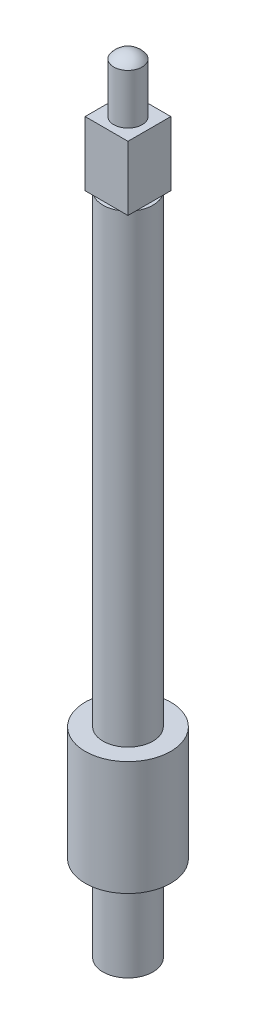
ISO-10303-21;
HEADER;
FILE_DESCRIPTION(('STEP AP214'),'2;1');
FILE_NAME('part.step','',(''),(''),'','','');
FILE_SCHEMA(('AUTOMOTIVE_DESIGN { 1 0 10303 214 1 1 1 1 }'));
ENDSEC;
DATA;
#1=APPLICATION_CONTEXT('core data for automotive mechanical design processes');
#2=APPLICATION_PROTOCOL_DEFINITION('international standard','automotive_design',2000,#1);
#3=PRODUCT_CONTEXT('',#1,'mechanical');
#4=PRODUCT('Part','Part','',(#3));
#5=PRODUCT_RELATED_PRODUCT_CATEGORY('part','',(#4));
#6=PRODUCT_DEFINITION_FORMATION('','',#4);
#7=PRODUCT_DEFINITION_CONTEXT('part definition',#1,'design');
#8=PRODUCT_DEFINITION('design','',#6,#7);
#9=PRODUCT_DEFINITION_SHAPE('','',#8);
#10=(LENGTH_UNIT() NAMED_UNIT(*) SI_UNIT(.MILLI.,.METRE.));
#11=(NAMED_UNIT(*) PLANE_ANGLE_UNIT() SI_UNIT($,.RADIAN.));
#12=(NAMED_UNIT(*) SI_UNIT($,.STERADIAN.) SOLID_ANGLE_UNIT());
#13=UNCERTAINTY_MEASURE_WITH_UNIT(LENGTH_MEASURE(1.E-05),#10,'distance_accuracy_value','');
#14=(GEOMETRIC_REPRESENTATION_CONTEXT(3) GLOBAL_UNCERTAINTY_ASSIGNED_CONTEXT((#13)) GLOBAL_UNIT_ASSIGNED_CONTEXT((#10,
#11,#12)) REPRESENTATION_CONTEXT('',''));
#15=CARTESIAN_POINT('',(0.,0.,0.));
#16=DIRECTION('',(0.,0.,1.));
#17=DIRECTION('',(1.,0.,0.));
#18=AXIS2_PLACEMENT_3D('',#15,#16,#17);
#19=CARTESIAN_POINT('',(0.,81.,0.));
#20=DIRECTION('',(0.,1.,0.));
#21=DIRECTION('',(0.,0.,1.));
#22=AXIS2_PLACEMENT_3D('',#19,#20,#21);
#23=PLANE('',#22);
#24=DIRECTION('',(0.,0.,-1.));
#25=VECTOR('',#24,1.);
#26=CARTESIAN_POINT('',(3.,81.,-3.));
#27=LINE('',#26,#25);
#28=CARTESIAN_POINT('',(3.,81.,1.802775637732));
#29=VERTEX_POINT('',#28);
#30=CARTESIAN_POINT('',(3.,81.,-1.802775637732));
#31=VERTEX_POINT('',#30);
#32=EDGE_CURVE('E51',#29,#31,#27,.T.);
#33=ORIENTED_EDGE('',*,*,#32,.F.);
#34=CARTESIAN_POINT('',(0.,81.,0.));
#35=DIRECTION('',(0.,1.,0.));
#36=DIRECTION('',(0.,0.,1.));
#37=AXIS2_PLACEMENT_3D('',#34,#35,#36);
#38=CIRCLE('',#37,3.5);
#39=EDGE_CURVE('E175',#29,#31,#38,.T.);
#40=ORIENTED_EDGE('',*,*,#39,.T.);
#41=EDGE_LOOP('',(#33,#40));
#42=FACE_BOUND('',#41,.T.);
#43=ADVANCED_FACE('F42',(#42),#23,.T.);
#44=DIRECTION('',(1.,0.,0.));
#45=VECTOR('',#44,1.);
#46=CARTESIAN_POINT('',(-3.,81.,3.));
#47=LINE('',#46,#45);
#48=CARTESIAN_POINT('',(-1.802775637732,81.,3.));
#49=VERTEX_POINT('',#48);
#50=CARTESIAN_POINT('',(1.802775637732,81.,3.));
#51=VERTEX_POINT('',#50);
#52=EDGE_CURVE('E57',#49,#51,#47,.T.);
#53=ORIENTED_EDGE('',*,*,#52,.F.);
#54=EDGE_CURVE('E176',#49,#51,#38,.T.);
#55=ORIENTED_EDGE('',*,*,#54,.T.);
#56=EDGE_LOOP('',(#53,#55));
#57=FACE_BOUND('',#56,.T.);
#58=ADVANCED_FACE('F203',(#57),#23,.T.);
#59=DIRECTION('',(0.,0.,1.));
#60=VECTOR('',#59,1.);
#61=CARTESIAN_POINT('',(-3.,81.,-3.));
#62=LINE('',#61,#60);
#63=CARTESIAN_POINT('',(-3.,81.,-1.80277563773199));
#64=VERTEX_POINT('',#63);
#65=CARTESIAN_POINT('',(-3.,81.,1.80277563773199));
#66=VERTEX_POINT('',#65);
#67=EDGE_CURVE('E156',#64,#66,#62,.T.);
#68=ORIENTED_EDGE('',*,*,#67,.F.);
#69=EDGE_CURVE('E228',#64,#66,#38,.T.);
#70=ORIENTED_EDGE('',*,*,#69,.T.);
#71=EDGE_LOOP('',(#68,#70));
#72=FACE_BOUND('',#71,.T.);
#73=ADVANCED_FACE('F209',(#72),#23,.T.);
#74=CARTESIAN_POINT('',(0.,16.,0.));
#75=DIRECTION('',(0.,-1.,0.));
#76=DIRECTION('',(0.,0.,-1.));
#77=AXIS2_PLACEMENT_3D('',#74,#75,#76);
#78=CYLINDRICAL_SURFACE('',#77,5.985);
#79=CARTESIAN_POINT('',(0.,16.,0.));
#80=DIRECTION('',(0.,1.,0.));
#81=DIRECTION('',(0.,0.,1.));
#82=AXIS2_PLACEMENT_3D('',#79,#80,#81);
#83=CIRCLE('',#82,5.985);
#84=CARTESIAN_POINT('',(0.,16.,5.985));
#85=VERTEX_POINT('',#84);
#86=EDGE_CURVE('E179',#85,#85,#83,.T.);
#87=ORIENTED_EDGE('',*,*,#86,.F.);
#88=EDGE_LOOP('',(#87));
#89=FACE_BOUND('',#88,.T.);
#90=CARTESIAN_POINT('',(0.,0.,0.));
#91=DIRECTION('',(0.,1.,0.));
#92=DIRECTION('',(0.,0.,1.));
#93=AXIS2_PLACEMENT_3D('',#90,#91,#92);
#94=CIRCLE('',#93,5.985);
#95=CARTESIAN_POINT('',(0.,0.,5.985));
#96=VERTEX_POINT('',#95);
#97=EDGE_CURVE('E174',#96,#96,#94,.T.);
#98=ORIENTED_EDGE('',*,*,#97,.T.);
#99=EDGE_LOOP('',(#98));
#100=FACE_BOUND('',#99,.T.);
#101=ADVANCED_FACE('F185',(#89,#100),#78,.T.);
#102=CARTESIAN_POINT('',(0.,16.,0.));
#103=DIRECTION('',(0.,1.,0.));
#104=DIRECTION('',(0.,0.,1.));
#105=AXIS2_PLACEMENT_3D('',#102,#103,#104);
#106=PLANE('',#105);
#107=CARTESIAN_POINT('',(0.,16.,0.));
#108=DIRECTION('',(0.,1.,0.));
#109=DIRECTION('',(0.,0.,1.));
#110=AXIS2_PLACEMENT_3D('',#107,#108,#109);
#111=CIRCLE('',#110,3.5);
#112=CARTESIAN_POINT('',(0.,16.,3.5));
#113=VERTEX_POINT('',#112);
#114=EDGE_CURVE('E170',#113,#113,#111,.T.);
#115=ORIENTED_EDGE('',*,*,#114,.F.);
#116=EDGE_LOOP('',(#115));
#117=FACE_BOUND('',#116,.T.);
#118=ORIENTED_EDGE('',*,*,#86,.T.);
#119=EDGE_LOOP('',(#118));
#120=FACE_BOUND('',#119,.T.);
#121=ADVANCED_FACE('F190',(#117,#120),#106,.T.);
#122=CARTESIAN_POINT('',(0.,0.,0.));
#123=DIRECTION('',(0.,1.,0.));
#124=DIRECTION('',(0.,0.,1.));
#125=AXIS2_PLACEMENT_3D('',#122,#123,#124);
#126=PLANE('',#125);
#127=CARTESIAN_POINT('',(0.,0.,0.));
#128=DIRECTION('',(0.,1.,0.));
#129=DIRECTION('',(0.,0.,1.));
#130=AXIS2_PLACEMENT_3D('',#127,#128,#129);
#131=CIRCLE('',#130,3.5);
#132=CARTESIAN_POINT('',(0.,0.,3.5));
#133=VERTEX_POINT('',#132);
#134=EDGE_CURVE('E11',#133,#133,#131,.F.);
#135=ORIENTED_EDGE('',*,*,#134,.F.);
#136=EDGE_LOOP('',(#135));
#137=FACE_BOUND('',#136,.T.);
#138=ORIENTED_EDGE('',*,*,#97,.F.);
#139=EDGE_LOOP('',(#138));
#140=FACE_BOUND('',#139,.T.);
#141=ADVANCED_FACE('F187',(#137,#140),#126,.F.);
#142=CARTESIAN_POINT('',(0.,81.,0.));
#143=DIRECTION('',(0.,-1.,0.));
#144=DIRECTION('',(0.,0.,-1.));
#145=AXIS2_PLACEMENT_3D('',#142,#143,#144);
#146=CYLINDRICAL_SURFACE('',#145,3.5);
#147=EDGE_CURVE('E171',#51,#29,#38,.T.);
#148=ORIENTED_EDGE('',*,*,#147,.F.);
#149=ORIENTED_EDGE('',*,*,#54,.F.);
#150=EDGE_CURVE('E64',#66,#49,#38,.T.);
#151=ORIENTED_EDGE('',*,*,#150,.F.);
#152=ORIENTED_EDGE('',*,*,#69,.F.);
#153=CARTESIAN_POINT('',(-1.80277563773199,81.,-3.));
#154=VERTEX_POINT('',#153);
#155=EDGE_CURVE('E236',#154,#64,#38,.T.);
#156=ORIENTED_EDGE('',*,*,#155,.F.);
#157=CARTESIAN_POINT('',(1.80277563773199,81.,-3.));
#158=VERTEX_POINT('',#157);
#159=EDGE_CURVE('E242',#158,#154,#38,.T.);
#160=ORIENTED_EDGE('',*,*,#159,.F.);
#161=EDGE_CURVE('E252',#31,#158,#38,.T.);
#162=ORIENTED_EDGE('',*,*,#161,.F.);
#163=ORIENTED_EDGE('',*,*,#39,.F.);
#164=EDGE_LOOP('',(#148,#149,#151,#152,#156,#160,#162,#163));
#165=FACE_BOUND('',#164,.T.);
#166=ORIENTED_EDGE('',*,*,#114,.T.);
#167=EDGE_LOOP('',(#166));
#168=FACE_BOUND('',#167,.T.);
#169=ADVANCED_FACE('F189',(#165,#168),#146,.T.);
#170=DIRECTION('',(-1.,0.,0.));
#171=VECTOR('',#170,1.);
#172=CARTESIAN_POINT('',(-3.,81.,-3.));
#173=LINE('',#172,#171);
#174=EDGE_CURVE('E151',#158,#154,#173,.T.);
#175=ORIENTED_EDGE('',*,*,#174,.F.);
#176=ORIENTED_EDGE('',*,*,#159,.T.);
#177=EDGE_LOOP('',(#175,#176));
#178=FACE_BOUND('',#177,.T.);
#179=ADVANCED_FACE('F197',(#178),#23,.T.);
#180=CARTESIAN_POINT('',(0.,81.,0.));
#181=DIRECTION('',(0.,1.,0.));
#182=DIRECTION('',(0.,0.,1.));
#183=AXIS2_PLACEMENT_3D('',#180,#181,#182);
#184=PLANE('',#183);
#185=CARTESIAN_POINT('',(3.,81.,3.));
#186=VERTEX_POINT('',#185);
#187=EDGE_CURVE('E155',#51,#186,#47,.T.);
#188=ORIENTED_EDGE('',*,*,#187,.F.);
#189=ORIENTED_EDGE('',*,*,#147,.T.);
#190=EDGE_CURVE('E142',#186,#29,#27,.T.);
#191=ORIENTED_EDGE('',*,*,#190,.F.);
#192=EDGE_LOOP('',(#188,#189,#191));
#193=FACE_BOUND('',#192,.T.);
#194=ADVANCED_FACE('F212',(#193),#184,.F.);
#195=CARTESIAN_POINT('',(3.,81.,-3.));
#196=VERTEX_POINT('',#195);
#197=EDGE_CURVE('E146',#31,#196,#27,.T.);
#198=ORIENTED_EDGE('',*,*,#197,.F.);
#199=ORIENTED_EDGE('',*,*,#161,.T.);
#200=EDGE_CURVE('E147',#196,#158,#173,.T.);
#201=ORIENTED_EDGE('',*,*,#200,.F.);
#202=EDGE_LOOP('',(#198,#199,#201));
#203=FACE_BOUND('',#202,.T.);
#204=ADVANCED_FACE('F217',(#203),#184,.F.);
#205=CARTESIAN_POINT('',(-3.,81.,-3.));
#206=VERTEX_POINT('',#205);
#207=EDGE_CURVE('E145',#154,#206,#173,.T.);
#208=ORIENTED_EDGE('',*,*,#207,.F.);
#209=ORIENTED_EDGE('',*,*,#155,.T.);
#210=EDGE_CURVE('E152',#206,#64,#62,.T.);
#211=ORIENTED_EDGE('',*,*,#210,.F.);
#212=EDGE_LOOP('',(#208,#209,#211));
#213=FACE_BOUND('',#212,.T.);
#214=ADVANCED_FACE('F240',(#213),#184,.F.);
#215=CARTESIAN_POINT('',(-3.,81.,3.));
#216=VERTEX_POINT('',#215);
#217=EDGE_CURVE('E150',#66,#216,#62,.T.);
#218=ORIENTED_EDGE('',*,*,#217,.F.);
#219=ORIENTED_EDGE('',*,*,#150,.T.);
#220=EDGE_CURVE('E135',#216,#49,#47,.T.);
#221=ORIENTED_EDGE('',*,*,#220,.F.);
#222=EDGE_LOOP('',(#218,#219,#221));
#223=FACE_BOUND('',#222,.T.);
#224=ADVANCED_FACE('F220',(#223),#184,.F.);
#225=CARTESIAN_POINT('',(3.,90.,-3.));
#226=DIRECTION('',(-1.,0.,0.));
#227=DIRECTION('',(0.,0.,1.));
#228=AXIS2_PLACEMENT_3D('',#225,#226,#227);
#229=PLANE('',#228);
#230=ORIENTED_EDGE('',*,*,#190,.T.);
#231=ORIENTED_EDGE('',*,*,#32,.T.);
#232=ORIENTED_EDGE('',*,*,#197,.T.);
#233=DIRECTION('',(0.,-1.,0.));
#234=VECTOR('',#233,1.);
#235=CARTESIAN_POINT('',(3.,90.,-3.));
#236=LINE('',#235,#234);
#237=CARTESIAN_POINT('',(3.,90.,-3.));
#238=VERTEX_POINT('',#237);
#239=EDGE_CURVE('E167',#238,#196,#236,.T.);
#240=ORIENTED_EDGE('',*,*,#239,.F.);
#241=DIRECTION('',(0.,0.,-1.));
#242=VECTOR('',#241,1.);
#243=CARTESIAN_POINT('',(3.,90.,-3.));
#244=LINE('',#243,#242);
#245=CARTESIAN_POINT('',(3.,90.,3.));
#246=VERTEX_POINT('',#245);
#247=EDGE_CURVE('E131',#246,#238,#244,.T.);
#248=ORIENTED_EDGE('',*,*,#247,.F.);
#249=DIRECTION('',(0.,-1.,0.));
#250=VECTOR('',#249,1.);
#251=CARTESIAN_POINT('',(3.,90.,3.));
#252=LINE('',#251,#250);
#253=EDGE_CURVE('E141',#246,#186,#252,.T.);
#254=ORIENTED_EDGE('',*,*,#253,.T.);
#255=EDGE_LOOP('',(#230,#231,#232,#240,#248,#254));
#256=FACE_BOUND('',#255,.T.);
#257=ADVANCED_FACE('F260',(#256),#229,.F.);
#258=CARTESIAN_POINT('',(-3.,90.,-3.));
#259=DIRECTION('',(0.,0.,1.));
#260=DIRECTION('',(1.,0.,0.));
#261=AXIS2_PLACEMENT_3D('',#258,#259,#260);
#262=PLANE('',#261);
#263=ORIENTED_EDGE('',*,*,#200,.T.);
#264=ORIENTED_EDGE('',*,*,#174,.T.);
#265=ORIENTED_EDGE('',*,*,#207,.T.);
#266=DIRECTION('',(0.,-1.,0.));
#267=VECTOR('',#266,1.);
#268=CARTESIAN_POINT('',(-3.,90.,-3.));
#269=LINE('',#268,#267);
#270=CARTESIAN_POINT('',(-3.,90.,-3.));
#271=VERTEX_POINT('',#270);
#272=EDGE_CURVE('E164',#271,#206,#269,.T.);
#273=ORIENTED_EDGE('',*,*,#272,.F.);
#274=DIRECTION('',(-1.,0.,0.));
#275=VECTOR('',#274,1.);
#276=CARTESIAN_POINT('',(-3.,90.,-3.));
#277=LINE('',#276,#275);
#278=EDGE_CURVE('E134',#238,#271,#277,.T.);
#279=ORIENTED_EDGE('',*,*,#278,.F.);
#280=ORIENTED_EDGE('',*,*,#239,.T.);
#281=EDGE_LOOP('',(#263,#264,#265,#273,#279,#280));
#282=FACE_BOUND('',#281,.T.);
#283=ADVANCED_FACE('F248',(#282),#262,.F.);
#284=CARTESIAN_POINT('',(-3.,90.,-3.));
#285=DIRECTION('',(1.,0.,0.));
#286=DIRECTION('',(0.,0.,-1.));
#287=AXIS2_PLACEMENT_3D('',#284,#285,#286);
#288=PLANE('',#287);
#289=ORIENTED_EDGE('',*,*,#210,.T.);
#290=ORIENTED_EDGE('',*,*,#67,.T.);
#291=ORIENTED_EDGE('',*,*,#217,.T.);
#292=DIRECTION('',(0.,-1.,0.));
#293=VECTOR('',#292,1.);
#294=CARTESIAN_POINT('',(-3.,90.,3.));
#295=LINE('',#294,#293);
#296=CARTESIAN_POINT('',(-3.,90.,3.));
#297=VERTEX_POINT('',#296);
#298=EDGE_CURVE('E161',#297,#216,#295,.T.);
#299=ORIENTED_EDGE('',*,*,#298,.F.);
#300=DIRECTION('',(0.,0.,1.));
#301=VECTOR('',#300,1.);
#302=CARTESIAN_POINT('',(-3.,90.,-3.));
#303=LINE('',#302,#301);
#304=EDGE_CURVE('E137',#271,#297,#303,.T.);
#305=ORIENTED_EDGE('',*,*,#304,.F.);
#306=ORIENTED_EDGE('',*,*,#272,.T.);
#307=EDGE_LOOP('',(#289,#290,#291,#299,#305,#306));
#308=FACE_BOUND('',#307,.T.);
#309=ADVANCED_FACE('F243',(#308),#288,.F.);
#310=CARTESIAN_POINT('',(-3.,90.,3.));
#311=DIRECTION('',(0.,0.,-1.));
#312=DIRECTION('',(-1.,0.,0.));
#313=AXIS2_PLACEMENT_3D('',#310,#311,#312);
#314=PLANE('',#313);
#315=ORIENTED_EDGE('',*,*,#220,.T.);
#316=ORIENTED_EDGE('',*,*,#52,.T.);
#317=ORIENTED_EDGE('',*,*,#187,.T.);
#318=ORIENTED_EDGE('',*,*,#253,.F.);
#319=DIRECTION('',(1.,0.,0.));
#320=VECTOR('',#319,1.);
#321=CARTESIAN_POINT('',(-3.,90.,3.));
#322=LINE('',#321,#320);
#323=EDGE_CURVE('E139',#297,#246,#322,.T.);
#324=ORIENTED_EDGE('',*,*,#323,.F.);
#325=ORIENTED_EDGE('',*,*,#298,.T.);
#326=EDGE_LOOP('',(#315,#316,#317,#318,#324,#325));
#327=FACE_BOUND('',#326,.T.);
#328=ADVANCED_FACE('F266',(#327),#314,.F.);
#329=CARTESIAN_POINT('',(0.,90.,0.));
#330=DIRECTION('',(0.,1.,0.));
#331=DIRECTION('',(0.,0.,1.));
#332=AXIS2_PLACEMENT_3D('',#329,#330,#331);
#333=PLANE('',#332);
#334=CARTESIAN_POINT('',(0.,90.,0.));
#335=DIRECTION('',(0.,1.,0.));
#336=DIRECTION('',(0.,0.,1.));
#337=AXIS2_PLACEMENT_3D('',#334,#335,#336);
#338=CIRCLE('',#337,1.99);
#339=CARTESIAN_POINT('',(0.,90.,1.99));
#340=VERTEX_POINT('',#339);
#341=EDGE_CURVE('E124',#340,#340,#338,.T.);
#342=ORIENTED_EDGE('',*,*,#341,.F.);
#343=EDGE_LOOP('',(#342));
#344=FACE_BOUND('',#343,.T.);
#345=ORIENTED_EDGE('',*,*,#247,.T.);
#346=ORIENTED_EDGE('',*,*,#278,.T.);
#347=ORIENTED_EDGE('',*,*,#304,.T.);
#348=ORIENTED_EDGE('',*,*,#323,.T.);
#349=EDGE_LOOP('',(#345,#346,#347,#348));
#350=FACE_BOUND('',#349,.T.);
#351=ADVANCED_FACE('F274',(#344,#350),#333,.T.);
#352=CARTESIAN_POINT('',(0.,97.,0.));
#353=DIRECTION('',(0.,-1.,0.));
#354=DIRECTION('',(0.,0.,-1.));
#355=AXIS2_PLACEMENT_3D('',#352,#353,#354);
#356=CYLINDRICAL_SURFACE('',#355,1.99);
#357=CARTESIAN_POINT('',(0.,97.,0.));
#358=DIRECTION('',(0.,1.,0.));
#359=DIRECTION('',(0.,0.,1.));
#360=AXIS2_PLACEMENT_3D('',#357,#358,#359);
#361=CIRCLE('',#360,1.99);
#362=CARTESIAN_POINT('',(0.,97.,1.99));
#363=VERTEX_POINT('',#362);
#364=EDGE_CURVE('E46',#363,#363,#361,.T.);
#365=ORIENTED_EDGE('',*,*,#364,.F.);
#366=EDGE_LOOP('',(#365));
#367=FACE_BOUND('',#366,.T.);
#368=ORIENTED_EDGE('',*,*,#341,.T.);
#369=EDGE_LOOP('',(#368));
#370=FACE_BOUND('',#369,.T.);
#371=ADVANCED_FACE('F271',(#367,#370),#356,.T.);
#372=CARTESIAN_POINT('',(0.,95.51995,0.));
#373=DIRECTION('',(0.,0.,1.));
#374=DIRECTION('',(1.,0.,0.));
#375=AXIS2_PLACEMENT_3D('',#372,#373,#374);
#376=SPHERICAL_SURFACE('',#375,2.48005);
#377=CARTESIAN_POINT('',(0.,95.51995,0.));
#378=DIRECTION('',(0.,1.,0.));
#379=DIRECTION('',(0.,0.,1.));
#380=AXIS2_PLACEMENT_3D('',#377,#378,#379);
#381=SPHERICAL_SURFACE('',#380,2.48005);
#382=ORIENTED_EDGE('',*,*,#364,.T.);
#383=EDGE_LOOP('',(#382));
#384=FACE_BOUND('',#383,.T.);
#385=ADVANCED_FACE('F44',(#384),#381,.T.);
#386=CARTESIAN_POINT('',(0.,-12.,0.));
#387=DIRECTION('',(0.,1.,0.));
#388=DIRECTION('',(0.,0.,1.));
#389=AXIS2_PLACEMENT_3D('',#386,#387,#388);
#390=CYLINDRICAL_SURFACE('',#389,3.5);
#391=CARTESIAN_POINT('',(0.,-12.,0.));
#392=DIRECTION('',(0.,-1.,0.));
#393=DIRECTION('',(0.,0.,-1.));
#394=AXIS2_PLACEMENT_3D('',#391,#392,#393);
#395=CIRCLE('',#394,3.5);
#396=CARTESIAN_POINT('',(0.,-12.,-3.5));
#397=VERTEX_POINT('',#396);
#398=EDGE_CURVE('E120',#397,#397,#395,.T.);
#399=ORIENTED_EDGE('',*,*,#398,.F.);
#400=EDGE_LOOP('',(#399));
#401=FACE_BOUND('',#400,.T.);
#402=ORIENTED_EDGE('',*,*,#134,.T.);
#403=EDGE_LOOP('',(#402));
#404=FACE_BOUND('',#403,.T.);
#405=ADVANCED_FACE('F321',(#401,#404),#390,.T.);
#406=CARTESIAN_POINT('',(0.,-12.,0.));
#407=DIRECTION('',(0.,-1.,0.));
#408=DIRECTION('',(0.,0.,-1.));
#409=AXIS2_PLACEMENT_3D('',#406,#407,#408);
#410=PLANE('',#409);
#411=CARTESIAN_POINT('',(0.,-12.,0.));
#412=DIRECTION('',(0.,-1.,0.));
#413=DIRECTION('',(0.,0.,-1.));
#414=AXIS2_PLACEMENT_3D('',#411,#412,#413);
#415=CIRCLE('',#414,1.64999999999999);
#416=CARTESIAN_POINT('',(0.,-12.,-1.64999999999999));
#417=VERTEX_POINT('',#416);
#418=EDGE_CURVE('E121',#417,#417,#415,.T.);
#419=ORIENTED_EDGE('',*,*,#418,.F.);
#420=EDGE_LOOP('',(#419));
#421=FACE_BOUND('',#420,.T.);
#422=ORIENTED_EDGE('',*,*,#398,.T.);
#423=EDGE_LOOP('',(#422));
#424=FACE_BOUND('',#423,.T.);
#425=ADVANCED_FACE('F114',(#421,#424),#410,.T.);
#426=CARTESIAN_POINT('',(0.,-2.99999999999999,0.));
#427=DIRECTION('',(0.,-1.,0.));
#428=DIRECTION('',(0.,0.,-1.));
#429=AXIS2_PLACEMENT_3D('',#426,#427,#428);
#430=CONICAL_SURFACE('',#429,1.64999999999999,1.02974425867665);
#431=CARTESIAN_POINT('',(0.,-2.00857997860452,0.));
#432=VERTEX_POINT('',#431);
#433=VERTEX_LOOP('',#432);
#434=FACE_BOUND('',#433,.T.);
#435=CARTESIAN_POINT('',(0.,-2.99999999999999,0.));
#436=DIRECTION('',(0.,-1.,0.));
#437=DIRECTION('',(0.,0.,-1.));
#438=AXIS2_PLACEMENT_3D('',#435,#436,#437);
#439=CIRCLE('',#438,1.64999999999999);
#440=CARTESIAN_POINT('',(0.,-2.99999999999999,-1.64999999999999));
#441=VERTEX_POINT('',#440);
#442=EDGE_CURVE('E118',#441,#441,#439,.T.);
#443=ORIENTED_EDGE('',*,*,#442,.T.);
#444=EDGE_LOOP('',(#443));
#445=FACE_BOUND('',#444,.T.);
#446=ADVANCED_FACE('F110',(#434,#445),#430,.F.);
#447=CARTESIAN_POINT('',(0.,-12.,0.));
#448=DIRECTION('',(0.,-1.,0.));
#449=DIRECTION('',(0.,0.,-1.));
#450=AXIS2_PLACEMENT_3D('',#447,#448,#449);
#451=CYLINDRICAL_SURFACE('',#450,1.64999999999999);
#452=ORIENTED_EDGE('',*,*,#442,.F.);
#453=EDGE_LOOP('',(#452));
#454=FACE_BOUND('',#453,.T.);
#455=ORIENTED_EDGE('',*,*,#418,.T.);
#456=EDGE_LOOP('',(#455));
#457=FACE_BOUND('',#456,.T.);
#458=ADVANCED_FACE('F113',(#454,#457),#451,.F.);
#459=CLOSED_SHELL('',(#43,#58,#73,#101,#121,#141,#169,#179,#194,#204,#214,#224,#257,#283,#309,
#328,#351,#371,#385,#405,#425,#446,#458));
#460=MANIFOLD_SOLID_BREP('B2',#459);
#461=ADVANCED_BREP_SHAPE_REPRESENTATION('',(#18,#460),#14);
#462=SHAPE_DEFINITION_REPRESENTATION(#9,#461);
ENDSEC;
END-ISO-10303-21;
